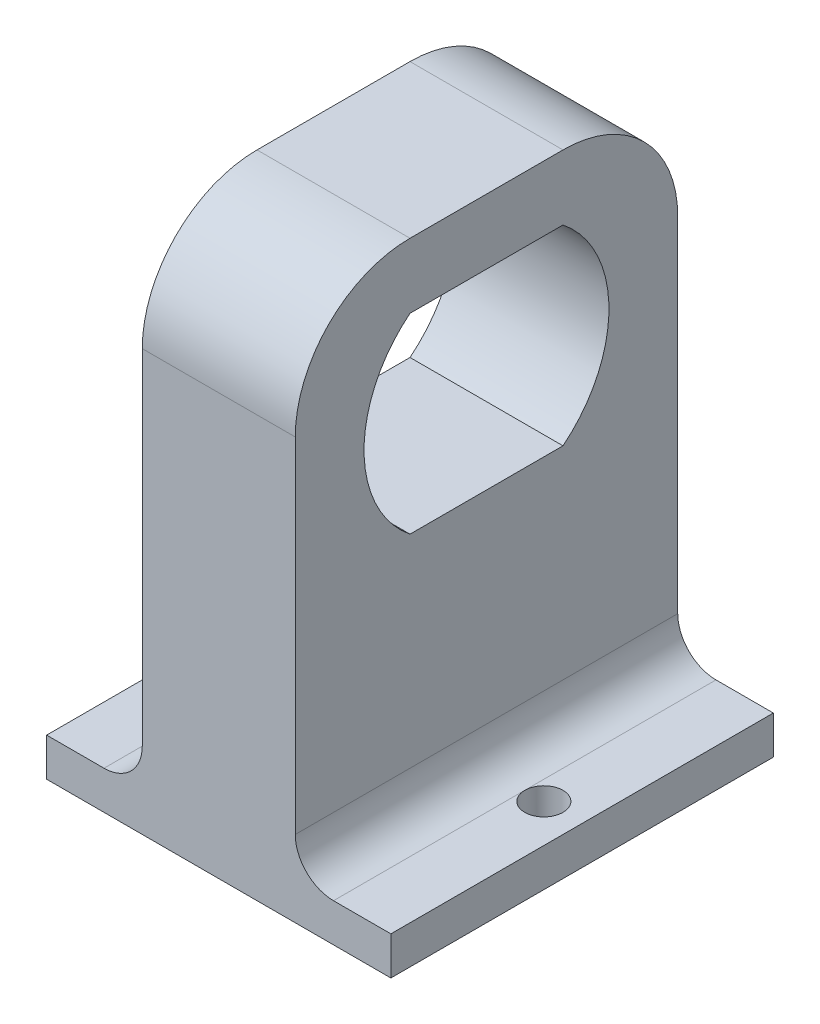
ISO-10303-21;
HEADER;
FILE_DESCRIPTION(('STEP AP214'),'2;1');
FILE_NAME('part.step','',(''),(''),'','','');
FILE_SCHEMA(('AUTOMOTIVE_DESIGN { 1 0 10303 214 1 1 1 1 }'));
ENDSEC;
DATA;
#1=APPLICATION_CONTEXT('core data for automotive mechanical design processes');
#2=APPLICATION_PROTOCOL_DEFINITION('international standard','automotive_design',2000,#1);
#3=PRODUCT_CONTEXT('',#1,'mechanical');
#4=PRODUCT('Part','Part','',(#3));
#5=PRODUCT_RELATED_PRODUCT_CATEGORY('part','',(#4));
#6=PRODUCT_DEFINITION_FORMATION('','',#4);
#7=PRODUCT_DEFINITION_CONTEXT('part definition',#1,'design');
#8=PRODUCT_DEFINITION('design','',#6,#7);
#9=PRODUCT_DEFINITION_SHAPE('','',#8);
#10=(LENGTH_UNIT() NAMED_UNIT(*) SI_UNIT(.MILLI.,.METRE.));
#11=(NAMED_UNIT(*) PLANE_ANGLE_UNIT() SI_UNIT($,.RADIAN.));
#12=(NAMED_UNIT(*) SI_UNIT($,.STERADIAN.) SOLID_ANGLE_UNIT());
#13=UNCERTAINTY_MEASURE_WITH_UNIT(LENGTH_MEASURE(1.E-05),#10,'distance_accuracy_value','');
#14=(GEOMETRIC_REPRESENTATION_CONTEXT(3) GLOBAL_UNCERTAINTY_ASSIGNED_CONTEXT((#13)) GLOBAL_UNIT_ASSIGNED_CONTEXT((#10,
#11,#12)) REPRESENTATION_CONTEXT('',''));
#15=CARTESIAN_POINT('',(0.,0.,0.));
#16=DIRECTION('',(0.,0.,1.));
#17=DIRECTION('',(1.,0.,0.));
#18=AXIS2_PLACEMENT_3D('',#15,#16,#17);
#19=CARTESIAN_POINT('',(12.7,0.,0.));
#20=DIRECTION('',(-1.,0.,0.));
#21=DIRECTION('',(0.,0.,1.));
#22=AXIS2_PLACEMENT_3D('',#19,#20,#21);
#23=PLANE('',#22);
#24=CARTESIAN_POINT('',(12.7,17.78,0.));
#25=DIRECTION('',(1.,0.,0.));
#26=DIRECTION('',(0.,0.,-1.));
#27=AXIS2_PLACEMENT_3D('',#24,#25,#26);
#28=CIRCLE('',#27,20.3299194538493);
#29=CARTESIAN_POINT('',(12.7,1.90500000000003,-12.7));
#30=VERTEX_POINT('',#29);
#31=CARTESIAN_POINT('',(12.7,33.655,-12.7));
#32=VERTEX_POINT('',#31);
#33=EDGE_CURVE('E205',#30,#32,#28,.T.);
#34=ORIENTED_EDGE('',*,*,#33,.F.);
#35=DIRECTION('',(0.,0.,-1.));
#36=VECTOR('',#35,1.);
#37=CARTESIAN_POINT('',(12.7,1.90500000000003,12.7));
#38=LINE('',#37,#36);
#39=CARTESIAN_POINT('',(12.7,1.90500000000003,12.7));
#40=VERTEX_POINT('',#39);
#41=EDGE_CURVE('E213',#40,#30,#38,.T.);
#42=ORIENTED_EDGE('',*,*,#41,.F.);
#43=CARTESIAN_POINT('',(12.7,17.78,0.));
#44=DIRECTION('',(1.,0.,0.));
#45=DIRECTION('',(0.,0.,-1.));
#46=AXIS2_PLACEMENT_3D('',#43,#44,#45);
#47=CIRCLE('',#46,20.3299194538493);
#48=CARTESIAN_POINT('',(12.7,33.655,12.7));
#49=VERTEX_POINT('',#48);
#50=EDGE_CURVE('E210',#49,#40,#47,.T.);
#51=ORIENTED_EDGE('',*,*,#50,.F.);
#52=DIRECTION('',(0.,0.,1.));
#53=VECTOR('',#52,1.);
#54=CARTESIAN_POINT('',(12.7,33.655,12.7));
#55=LINE('',#54,#53);
#56=EDGE_CURVE('E207',#32,#49,#55,.T.);
#57=ORIENTED_EDGE('',*,*,#56,.F.);
#58=EDGE_LOOP('',(#34,#42,#51,#57));
#59=FACE_BOUND('',#58,.T.);
#60=DIRECTION('',(0.,1.,0.));
#61=VECTOR('',#60,1.);
#62=CARTESIAN_POINT('',(12.7,-44.45,-31.75));
#63=LINE('',#62,#61);
#64=CARTESIAN_POINT('',(12.7,-31.75,-31.75));
#65=VERTEX_POINT('',#64);
#66=CARTESIAN_POINT('',(12.7,25.4,-31.75));
#67=VERTEX_POINT('',#66);
#68=EDGE_CURVE('E236',#65,#67,#63,.T.);
#69=ORIENTED_EDGE('',*,*,#68,.T.);
#70=CARTESIAN_POINT('',(12.7,25.4,-12.7));
#71=DIRECTION('',(-1.,0.,0.));
#72=DIRECTION('',(0.,0.,1.));
#73=AXIS2_PLACEMENT_3D('',#70,#71,#72);
#74=CIRCLE('',#73,19.05);
#75=CARTESIAN_POINT('',(12.7,44.45,-12.7));
#76=VERTEX_POINT('',#75);
#77=EDGE_CURVE('E41',#67,#76,#74,.F.);
#78=ORIENTED_EDGE('',*,*,#77,.T.);
#79=DIRECTION('',(0.,0.,1.));
#80=VECTOR('',#79,1.);
#81=CARTESIAN_POINT('',(12.7,44.45,31.75));
#82=LINE('',#81,#80);
#83=CARTESIAN_POINT('',(12.7,44.45,12.7));
#84=VERTEX_POINT('',#83);
#85=EDGE_CURVE('E238',#76,#84,#82,.T.);
#86=ORIENTED_EDGE('',*,*,#85,.T.);
#87=CARTESIAN_POINT('',(12.7,25.4,12.7));
#88=DIRECTION('',(-1.,0.,0.));
#89=DIRECTION('',(0.,0.,1.));
#90=AXIS2_PLACEMENT_3D('',#87,#88,#89);
#91=CIRCLE('',#90,19.05);
#92=CARTESIAN_POINT('',(12.7,25.4,31.75));
#93=VERTEX_POINT('',#92);
#94=EDGE_CURVE('E48',#84,#93,#91,.F.);
#95=ORIENTED_EDGE('',*,*,#94,.T.);
#96=DIRECTION('',(0.,-1.,0.));
#97=VECTOR('',#96,1.);
#98=CARTESIAN_POINT('',(12.7,-44.45,31.75));
#99=LINE('',#98,#97);
#100=CARTESIAN_POINT('',(12.7,-31.75,31.75));
#101=VERTEX_POINT('',#100);
#102=EDGE_CURVE('E241',#93,#101,#99,.T.);
#103=ORIENTED_EDGE('',*,*,#102,.T.);
#104=DIRECTION('',(0.,0.,1.));
#105=VECTOR('',#104,1.);
#106=CARTESIAN_POINT('',(12.7,-31.75,-31.75));
#107=LINE('',#106,#105);
#108=EDGE_CURVE('E259',#101,#65,#107,.F.);
#109=ORIENTED_EDGE('',*,*,#108,.T.);
#110=EDGE_LOOP('',(#69,#78,#86,#95,#103,#109));
#111=FACE_BOUND('',#110,.T.);
#112=ADVANCED_FACE('F33',(#59,#111),#23,.F.);
#113=CARTESIAN_POINT('',(-12.7,0.,0.));
#114=DIRECTION('',(-1.,0.,0.));
#115=DIRECTION('',(0.,0.,1.));
#116=AXIS2_PLACEMENT_3D('',#113,#114,#115);
#117=PLANE('',#116);
#118=DIRECTION('',(0.,0.,-1.));
#119=VECTOR('',#118,1.);
#120=CARTESIAN_POINT('',(-12.7,1.90500000000003,12.7));
#121=LINE('',#120,#119);
#122=CARTESIAN_POINT('',(-12.7,1.90500000000002,12.7));
#123=VERTEX_POINT('',#122);
#124=CARTESIAN_POINT('',(-12.7,1.90500000000003,-12.7));
#125=VERTEX_POINT('',#124);
#126=EDGE_CURVE('E208',#123,#125,#121,.T.);
#127=ORIENTED_EDGE('',*,*,#126,.T.);
#128=CARTESIAN_POINT('',(-12.7,17.78,0.));
#129=DIRECTION('',(1.,0.,0.));
#130=DIRECTION('',(0.,0.,-1.));
#131=AXIS2_PLACEMENT_3D('',#128,#129,#130);
#132=CIRCLE('',#131,20.3299194538493);
#133=CARTESIAN_POINT('',(-12.7,33.655,-12.7));
#134=VERTEX_POINT('',#133);
#135=EDGE_CURVE('E204',#125,#134,#132,.T.);
#136=ORIENTED_EDGE('',*,*,#135,.T.);
#137=DIRECTION('',(0.,0.,1.));
#138=VECTOR('',#137,1.);
#139=CARTESIAN_POINT('',(-12.7,33.655,12.7));
#140=LINE('',#139,#138);
#141=CARTESIAN_POINT('',(-12.7,33.655,12.7));
#142=VERTEX_POINT('',#141);
#143=EDGE_CURVE('E218',#134,#142,#140,.T.);
#144=ORIENTED_EDGE('',*,*,#143,.T.);
#145=CARTESIAN_POINT('',(-12.7,17.78,0.));
#146=DIRECTION('',(1.,0.,0.));
#147=DIRECTION('',(0.,0.,-1.));
#148=AXIS2_PLACEMENT_3D('',#145,#146,#147);
#149=CIRCLE('',#148,20.3299194538493);
#150=EDGE_CURVE('E221',#142,#123,#149,.T.);
#151=ORIENTED_EDGE('',*,*,#150,.T.);
#152=EDGE_LOOP('',(#127,#136,#144,#151));
#153=FACE_BOUND('',#152,.T.);
#154=DIRECTION('',(0.,0.,1.));
#155=VECTOR('',#154,1.);
#156=CARTESIAN_POINT('',(-12.7,44.45,31.75));
#157=LINE('',#156,#155);
#158=CARTESIAN_POINT('',(-12.7,44.45,-12.7));
#159=VERTEX_POINT('',#158);
#160=CARTESIAN_POINT('',(-12.7,44.45,12.7));
#161=VERTEX_POINT('',#160);
#162=EDGE_CURVE('E244',#159,#161,#157,.T.);
#163=ORIENTED_EDGE('',*,*,#162,.F.);
#164=CARTESIAN_POINT('',(-12.7,25.4,-12.7));
#165=DIRECTION('',(-1.,0.,0.));
#166=DIRECTION('',(0.,0.,1.));
#167=AXIS2_PLACEMENT_3D('',#164,#165,#166);
#168=CIRCLE('',#167,19.05);
#169=CARTESIAN_POINT('',(-12.7,25.4,-31.75));
#170=VERTEX_POINT('',#169);
#171=EDGE_CURVE('E277',#159,#170,#168,.T.);
#172=ORIENTED_EDGE('',*,*,#171,.T.);
#173=DIRECTION('',(0.,1.,0.));
#174=VECTOR('',#173,1.);
#175=CARTESIAN_POINT('',(-12.7,-44.45,-31.75));
#176=LINE('',#175,#174);
#177=CARTESIAN_POINT('',(-12.7,-31.75,-31.75));
#178=VERTEX_POINT('',#177);
#179=EDGE_CURVE('E235',#178,#170,#176,.T.);
#180=ORIENTED_EDGE('',*,*,#179,.F.);
#181=DIRECTION('',(0.,0.,1.));
#182=VECTOR('',#181,1.);
#183=CARTESIAN_POINT('',(-12.7,-31.75,0.));
#184=LINE('',#183,#182);
#185=CARTESIAN_POINT('',(-12.7,-31.75,31.75));
#186=VERTEX_POINT('',#185);
#187=EDGE_CURVE('E166',#178,#186,#184,.T.);
#188=ORIENTED_EDGE('',*,*,#187,.T.);
#189=DIRECTION('',(0.,-1.,0.));
#190=VECTOR('',#189,1.);
#191=CARTESIAN_POINT('',(-12.7,-44.45,31.75));
#192=LINE('',#191,#190);
#193=CARTESIAN_POINT('',(-12.7,25.4,31.75));
#194=VERTEX_POINT('',#193);
#195=EDGE_CURVE('E239',#194,#186,#192,.T.);
#196=ORIENTED_EDGE('',*,*,#195,.F.);
#197=CARTESIAN_POINT('',(-12.7,25.4,12.7));
#198=DIRECTION('',(-1.,0.,0.));
#199=DIRECTION('',(0.,0.,1.));
#200=AXIS2_PLACEMENT_3D('',#197,#198,#199);
#201=CIRCLE('',#200,19.05);
#202=EDGE_CURVE('E275',#194,#161,#201,.T.);
#203=ORIENTED_EDGE('',*,*,#202,.T.);
#204=EDGE_LOOP('',(#163,#172,#180,#188,#196,#203));
#205=FACE_BOUND('',#204,.T.);
#206=ADVANCED_FACE('F291',(#153,#205),#117,.T.);
#207=CARTESIAN_POINT('',(12.7,-44.45,-31.75));
#208=DIRECTION('',(0.,0.,1.));
#209=DIRECTION('',(1.,0.,0.));
#210=AXIS2_PLACEMENT_3D('',#207,#208,#209);
#211=PLANE('',#210);
#212=ORIENTED_EDGE('',*,*,#179,.T.);
#213=DIRECTION('',(-1.,0.,0.));
#214=VECTOR('',#213,1.);
#215=CARTESIAN_POINT('',(12.7,25.4,-31.75));
#216=LINE('',#215,#214);
#217=EDGE_CURVE('E56',#170,#67,#216,.F.);
#218=ORIENTED_EDGE('',*,*,#217,.T.);
#219=ORIENTED_EDGE('',*,*,#68,.F.);
#220=CARTESIAN_POINT('',(19.05,-31.75,-31.75));
#221=DIRECTION('',(0.,0.,1.));
#222=DIRECTION('',(1.,0.,0.));
#223=AXIS2_PLACEMENT_3D('',#220,#221,#222);
#224=CIRCLE('',#223,6.35);
#225=CARTESIAN_POINT('',(19.05,-38.1,-31.75));
#226=VERTEX_POINT('',#225);
#227=EDGE_CURVE('E268',#65,#226,#224,.T.);
#228=ORIENTED_EDGE('',*,*,#227,.T.);
#229=DIRECTION('',(-1.,0.,0.));
#230=VECTOR('',#229,1.);
#231=CARTESIAN_POINT('',(28.575,-38.1,-31.75));
#232=LINE('',#231,#230);
#233=CARTESIAN_POINT('',(28.575,-38.1,-31.75));
#234=VERTEX_POINT('',#233);
#235=EDGE_CURVE('E201',#234,#226,#232,.T.);
#236=ORIENTED_EDGE('',*,*,#235,.F.);
#237=DIRECTION('',(0.,1.,0.));
#238=VECTOR('',#237,1.);
#239=CARTESIAN_POINT('',(28.575,-44.45,-31.75));
#240=LINE('',#239,#238);
#241=CARTESIAN_POINT('',(28.575,-44.45,-31.75));
#242=VERTEX_POINT('',#241);
#243=EDGE_CURVE('E174',#242,#234,#240,.T.);
#244=ORIENTED_EDGE('',*,*,#243,.F.);
#245=DIRECTION('',(-1.,0.,0.));
#246=VECTOR('',#245,1.);
#247=CARTESIAN_POINT('',(12.7,-44.45,-31.75));
#248=LINE('',#247,#246);
#249=CARTESIAN_POINT('',(-28.575,-44.45,-31.75));
#250=VERTEX_POINT('',#249);
#251=EDGE_CURVE('E167',#242,#250,#248,.T.);
#252=ORIENTED_EDGE('',*,*,#251,.T.);
#253=DIRECTION('',(0.,1.,0.));
#254=VECTOR('',#253,1.);
#255=CARTESIAN_POINT('',(-28.575,-44.45,-31.75));
#256=LINE('',#255,#254);
#257=CARTESIAN_POINT('',(-28.575,-38.1,-31.75));
#258=VERTEX_POINT('',#257);
#259=EDGE_CURVE('E183',#250,#258,#256,.T.);
#260=ORIENTED_EDGE('',*,*,#259,.T.);
#261=CARTESIAN_POINT('',(-19.05,-38.1,-31.75));
#262=VERTEX_POINT('',#261);
#263=EDGE_CURVE('E200',#262,#258,#232,.T.);
#264=ORIENTED_EDGE('',*,*,#263,.F.);
#265=CARTESIAN_POINT('',(-19.05,-31.75,-31.75));
#266=DIRECTION('',(0.,0.,1.));
#267=DIRECTION('',(1.,0.,0.));
#268=AXIS2_PLACEMENT_3D('',#265,#266,#267);
#269=CIRCLE('',#268,6.35);
#270=EDGE_CURVE('E263',#262,#178,#269,.T.);
#271=ORIENTED_EDGE('',*,*,#270,.T.);
#272=EDGE_LOOP('',(#212,#218,#219,#228,#236,#244,#252,#260,#264,#271));
#273=FACE_BOUND('',#272,.T.);
#274=ADVANCED_FACE('F293',(#273),#211,.F.);
#275=CARTESIAN_POINT('',(12.7,44.45,31.75));
#276=DIRECTION('',(0.,-1.,0.));
#277=DIRECTION('',(0.,0.,-1.));
#278=AXIS2_PLACEMENT_3D('',#275,#276,#277);
#279=PLANE('',#278);
#280=ORIENTED_EDGE('',*,*,#85,.F.);
#281=DIRECTION('',(-1.,0.,0.));
#282=VECTOR('',#281,1.);
#283=CARTESIAN_POINT('',(12.7,44.45,-12.7));
#284=LINE('',#283,#282);
#285=EDGE_CURVE('E272',#76,#159,#284,.T.);
#286=ORIENTED_EDGE('',*,*,#285,.T.);
#287=ORIENTED_EDGE('',*,*,#162,.T.);
#288=DIRECTION('',(-1.,0.,0.));
#289=VECTOR('',#288,1.);
#290=CARTESIAN_POINT('',(12.7,44.45,12.7));
#291=LINE('',#290,#289);
#292=EDGE_CURVE('E270',#161,#84,#291,.F.);
#293=ORIENTED_EDGE('',*,*,#292,.T.);
#294=EDGE_LOOP('',(#280,#286,#287,#293));
#295=FACE_BOUND('',#294,.T.);
#296=ADVANCED_FACE('F285',(#295),#279,.F.);
#297=CARTESIAN_POINT('',(12.7,-44.45,31.75));
#298=DIRECTION('',(0.,0.,-1.));
#299=DIRECTION('',(-1.,0.,0.));
#300=AXIS2_PLACEMENT_3D('',#297,#298,#299);
#301=PLANE('',#300);
#302=ORIENTED_EDGE('',*,*,#102,.F.);
#303=DIRECTION('',(-1.,0.,0.));
#304=VECTOR('',#303,1.);
#305=CARTESIAN_POINT('',(12.7,25.4,31.75));
#306=LINE('',#305,#304);
#307=EDGE_CURVE('E11',#93,#194,#306,.T.);
#308=ORIENTED_EDGE('',*,*,#307,.T.);
#309=ORIENTED_EDGE('',*,*,#195,.T.);
#310=CARTESIAN_POINT('',(-19.05,-31.75,31.75));
#311=DIRECTION('',(0.,0.,-1.));
#312=DIRECTION('',(-1.,0.,0.));
#313=AXIS2_PLACEMENT_3D('',#310,#311,#312);
#314=CIRCLE('',#313,6.35);
#315=CARTESIAN_POINT('',(-19.05,-38.1,31.75));
#316=VERTEX_POINT('',#315);
#317=EDGE_CURVE('E261',#186,#316,#314,.T.);
#318=ORIENTED_EDGE('',*,*,#317,.T.);
#319=DIRECTION('',(-1.,0.,0.));
#320=VECTOR('',#319,1.);
#321=CARTESIAN_POINT('',(28.575,-38.1,31.75));
#322=LINE('',#321,#320);
#323=CARTESIAN_POINT('',(-28.575,-38.1,31.75));
#324=VERTEX_POINT('',#323);
#325=EDGE_CURVE('E191',#316,#324,#322,.T.);
#326=ORIENTED_EDGE('',*,*,#325,.T.);
#327=DIRECTION('',(0.,-1.,0.));
#328=VECTOR('',#327,1.);
#329=CARTESIAN_POINT('',(-28.575,-44.45,31.75));
#330=LINE('',#329,#328);
#331=CARTESIAN_POINT('',(-28.575,-44.45,31.75));
#332=VERTEX_POINT('',#331);
#333=EDGE_CURVE('E162',#324,#332,#330,.T.);
#334=ORIENTED_EDGE('',*,*,#333,.T.);
#335=DIRECTION('',(-1.,0.,0.));
#336=VECTOR('',#335,1.);
#337=CARTESIAN_POINT('',(12.7,-44.45,31.75));
#338=LINE('',#337,#336);
#339=CARTESIAN_POINT('',(28.575,-44.45,31.75));
#340=VERTEX_POINT('',#339);
#341=EDGE_CURVE('E155',#340,#332,#338,.T.);
#342=ORIENTED_EDGE('',*,*,#341,.F.);
#343=DIRECTION('',(0.,-1.,0.));
#344=VECTOR('',#343,1.);
#345=CARTESIAN_POINT('',(28.575,-44.45,31.75));
#346=LINE('',#345,#344);
#347=CARTESIAN_POINT('',(28.575,-38.1,31.75));
#348=VERTEX_POINT('',#347);
#349=EDGE_CURVE('E160',#348,#340,#346,.T.);
#350=ORIENTED_EDGE('',*,*,#349,.F.);
#351=CARTESIAN_POINT('',(19.05,-38.1,31.75));
#352=VERTEX_POINT('',#351);
#353=EDGE_CURVE('E198',#348,#352,#322,.T.);
#354=ORIENTED_EDGE('',*,*,#353,.T.);
#355=CARTESIAN_POINT('',(19.05,-31.75,31.75));
#356=DIRECTION('',(0.,0.,-1.));
#357=DIRECTION('',(-1.,0.,0.));
#358=AXIS2_PLACEMENT_3D('',#355,#356,#357);
#359=CIRCLE('',#358,6.35);
#360=EDGE_CURVE('E265',#352,#101,#359,.T.);
#361=ORIENTED_EDGE('',*,*,#360,.T.);
#362=EDGE_LOOP('',(#302,#308,#309,#318,#326,#334,#342,#350,#354,#361));
#363=FACE_BOUND('',#362,.T.);
#364=ADVANCED_FACE('F157',(#363),#301,.F.);
#365=CARTESIAN_POINT('',(12.7,-44.45,31.75));
#366=DIRECTION('',(0.,1.,0.));
#367=DIRECTION('',(0.,0.,1.));
#368=AXIS2_PLACEMENT_3D('',#365,#366,#367);
#369=PLANE('',#368);
#370=CARTESIAN_POINT('',(-22.225,-44.45,0.));
#371=DIRECTION('',(0.,-1.,0.));
#372=DIRECTION('',(0.,0.,1.));
#373=AXIS2_PLACEMENT_3D('',#370,#371,#372);
#374=CIRCLE('',#373,3.175);
#375=CARTESIAN_POINT('',(-22.225,-44.45,3.175));
#376=VERTEX_POINT('',#375);
#377=EDGE_CURVE('E353',#376,#376,#374,.T.);
#378=ORIENTED_EDGE('',*,*,#377,.F.);
#379=EDGE_LOOP('',(#378));
#380=FACE_BOUND('',#379,.T.);
#381=CARTESIAN_POINT('',(22.225,-44.45,0.));
#382=DIRECTION('',(0.,1.,0.));
#383=DIRECTION('',(0.,0.,1.));
#384=AXIS2_PLACEMENT_3D('',#381,#382,#383);
#385=CIRCLE('',#384,3.175);
#386=CARTESIAN_POINT('',(22.225,-44.45,3.175));
#387=VERTEX_POINT('',#386);
#388=EDGE_CURVE('E194',#387,#387,#385,.T.);
#389=ORIENTED_EDGE('',*,*,#388,.T.);
#390=EDGE_LOOP('',(#389));
#391=FACE_BOUND('',#390,.T.);
#392=ORIENTED_EDGE('',*,*,#341,.T.);
#393=DIRECTION('',(0.,0.,-1.));
#394=VECTOR('',#393,1.);
#395=CARTESIAN_POINT('',(-28.575,-44.45,31.75));
#396=LINE('',#395,#394);
#397=EDGE_CURVE('E193',#332,#250,#396,.T.);
#398=ORIENTED_EDGE('',*,*,#397,.T.);
#399=ORIENTED_EDGE('',*,*,#251,.F.);
#400=DIRECTION('',(0.,0.,-1.));
#401=VECTOR('',#400,1.);
#402=CARTESIAN_POINT('',(28.575,-44.45,31.75));
#403=LINE('',#402,#401);
#404=EDGE_CURVE('E170',#340,#242,#403,.T.);
#405=ORIENTED_EDGE('',*,*,#404,.F.);
#406=EDGE_LOOP('',(#392,#398,#399,#405));
#407=FACE_BOUND('',#406,.T.);
#408=ADVANCED_FACE('F171',(#380,#391,#407),#369,.F.);
#409=CARTESIAN_POINT('',(12.7,17.78,0.));
#410=DIRECTION('',(-1.,0.,0.));
#411=DIRECTION('',(0.,0.,1.));
#412=AXIS2_PLACEMENT_3D('',#409,#410,#411);
#413=CYLINDRICAL_SURFACE('',#412,20.3299194538493);
#414=ORIENTED_EDGE('',*,*,#135,.F.);
#415=DIRECTION('',(-1.,0.,0.));
#416=VECTOR('',#415,1.);
#417=CARTESIAN_POINT('',(12.7,1.90500000000003,-12.7));
#418=LINE('',#417,#416);
#419=EDGE_CURVE('E215',#30,#125,#418,.T.);
#420=ORIENTED_EDGE('',*,*,#419,.F.);
#421=ORIENTED_EDGE('',*,*,#33,.T.);
#422=DIRECTION('',(-1.,0.,0.));
#423=VECTOR('',#422,1.);
#424=CARTESIAN_POINT('',(12.7,33.655,-12.7));
#425=LINE('',#424,#423);
#426=EDGE_CURVE('E232',#32,#134,#425,.T.);
#427=ORIENTED_EDGE('',*,*,#426,.T.);
#428=EDGE_LOOP('',(#414,#420,#421,#427));
#429=FACE_BOUND('',#428,.T.);
#430=ADVANCED_FACE('F320',(#429),#413,.F.);
#431=CARTESIAN_POINT('',(12.7,33.655,12.7));
#432=DIRECTION('',(0.,-1.,0.));
#433=DIRECTION('',(0.,0.,-1.));
#434=AXIS2_PLACEMENT_3D('',#431,#432,#433);
#435=PLANE('',#434);
#436=ORIENTED_EDGE('',*,*,#143,.F.);
#437=ORIENTED_EDGE('',*,*,#426,.F.);
#438=ORIENTED_EDGE('',*,*,#56,.T.);
#439=DIRECTION('',(-1.,0.,0.));
#440=VECTOR('',#439,1.);
#441=CARTESIAN_POINT('',(12.7,33.655,12.7));
#442=LINE('',#441,#440);
#443=EDGE_CURVE('E230',#49,#142,#442,.T.);
#444=ORIENTED_EDGE('',*,*,#443,.T.);
#445=EDGE_LOOP('',(#436,#437,#438,#444));
#446=FACE_BOUND('',#445,.T.);
#447=ADVANCED_FACE('F384',(#446),#435,.T.);
#448=CARTESIAN_POINT('',(12.7,17.78,0.));
#449=DIRECTION('',(-1.,0.,0.));
#450=DIRECTION('',(0.,0.,1.));
#451=AXIS2_PLACEMENT_3D('',#448,#449,#450);
#452=CYLINDRICAL_SURFACE('',#451,20.3299194538493);
#453=ORIENTED_EDGE('',*,*,#150,.F.);
#454=ORIENTED_EDGE('',*,*,#443,.F.);
#455=ORIENTED_EDGE('',*,*,#50,.T.);
#456=DIRECTION('',(-1.,0.,0.));
#457=VECTOR('',#456,1.);
#458=CARTESIAN_POINT('',(12.7,1.90500000000002,12.7));
#459=LINE('',#458,#457);
#460=EDGE_CURVE('E228',#40,#123,#459,.T.);
#461=ORIENTED_EDGE('',*,*,#460,.T.);
#462=EDGE_LOOP('',(#453,#454,#455,#461));
#463=FACE_BOUND('',#462,.T.);
#464=ADVANCED_FACE('F381',(#463),#452,.F.);
#465=CARTESIAN_POINT('',(12.7,1.90500000000003,12.7));
#466=DIRECTION('',(0.,1.,0.));
#467=DIRECTION('',(0.,0.,1.));
#468=AXIS2_PLACEMENT_3D('',#465,#466,#467);
#469=PLANE('',#468);
#470=ORIENTED_EDGE('',*,*,#126,.F.);
#471=ORIENTED_EDGE('',*,*,#460,.F.);
#472=ORIENTED_EDGE('',*,*,#41,.T.);
#473=ORIENTED_EDGE('',*,*,#419,.T.);
#474=EDGE_LOOP('',(#470,#471,#472,#473));
#475=FACE_BOUND('',#474,.T.);
#476=ADVANCED_FACE('F375',(#475),#469,.T.);
#477=CARTESIAN_POINT('',(-28.575,0.,0.));
#478=DIRECTION('',(-1.,0.,0.));
#479=DIRECTION('',(0.,0.,1.));
#480=AXIS2_PLACEMENT_3D('',#477,#478,#479);
#481=PLANE('',#480);
#482=ORIENTED_EDGE('',*,*,#333,.F.);
#483=DIRECTION('',(0.,0.,1.));
#484=VECTOR('',#483,1.);
#485=CARTESIAN_POINT('',(-28.575,-38.1,31.75));
#486=LINE('',#485,#484);
#487=EDGE_CURVE('E180',#258,#324,#486,.T.);
#488=ORIENTED_EDGE('',*,*,#487,.F.);
#489=ORIENTED_EDGE('',*,*,#259,.F.);
#490=ORIENTED_EDGE('',*,*,#397,.F.);
#491=EDGE_LOOP('',(#482,#488,#489,#490));
#492=FACE_BOUND('',#491,.T.);
#493=ADVANCED_FACE('F372',(#492),#481,.T.);
#494=CARTESIAN_POINT('',(28.575,-38.1,31.75));
#495=DIRECTION('',(0.,-1.,0.));
#496=DIRECTION('',(0.,0.,-1.));
#497=AXIS2_PLACEMENT_3D('',#494,#495,#496);
#498=PLANE('',#497);
#499=DIRECTION('',(0.,0.,1.));
#500=VECTOR('',#499,1.);
#501=CARTESIAN_POINT('',(-19.05,-38.1,31.75));
#502=LINE('',#501,#500);
#503=CARTESIAN_POINT('',(-19.05,-38.1,0.));
#504=VERTEX_POINT('',#503);
#505=EDGE_CURVE('E252',#316,#504,#502,.F.);
#506=ORIENTED_EDGE('',*,*,#505,.T.);
#507=CARTESIAN_POINT('',(-22.225,-38.1,0.));
#508=DIRECTION('',(0.,-1.,0.));
#509=DIRECTION('',(0.,0.,1.));
#510=AXIS2_PLACEMENT_3D('',#507,#508,#509);
#511=CIRCLE('',#510,3.175);
#512=EDGE_CURVE('E356',#504,#504,#511,.T.);
#513=ORIENTED_EDGE('',*,*,#512,.T.);
#514=EDGE_CURVE('E251',#504,#262,#502,.F.);
#515=ORIENTED_EDGE('',*,*,#514,.T.);
#516=ORIENTED_EDGE('',*,*,#263,.T.);
#517=ORIENTED_EDGE('',*,*,#487,.T.);
#518=ORIENTED_EDGE('',*,*,#325,.F.);
#519=EDGE_LOOP('',(#506,#513,#515,#516,#517,#518));
#520=FACE_BOUND('',#519,.T.);
#521=ADVANCED_FACE('F363',(#520),#498,.F.);
#522=DIRECTION('',(0.,0.,1.));
#523=VECTOR('',#522,1.);
#524=CARTESIAN_POINT('',(19.05,-38.1,31.75));
#525=LINE('',#524,#523);
#526=CARTESIAN_POINT('',(19.05,-38.1,0.));
#527=VERTEX_POINT('',#526);
#528=EDGE_CURVE('E256',#226,#527,#525,.T.);
#529=ORIENTED_EDGE('',*,*,#528,.T.);
#530=CARTESIAN_POINT('',(22.225,-38.1,0.));
#531=DIRECTION('',(0.,1.,0.));
#532=DIRECTION('',(0.,0.,1.));
#533=AXIS2_PLACEMENT_3D('',#530,#531,#532);
#534=CIRCLE('',#533,3.175);
#535=EDGE_CURVE('E186',#527,#527,#534,.T.);
#536=ORIENTED_EDGE('',*,*,#535,.F.);
#537=EDGE_CURVE('E255',#527,#352,#525,.T.);
#538=ORIENTED_EDGE('',*,*,#537,.T.);
#539=ORIENTED_EDGE('',*,*,#353,.F.);
#540=DIRECTION('',(0.,0.,1.));
#541=VECTOR('',#540,1.);
#542=CARTESIAN_POINT('',(28.575,-38.1,31.75));
#543=LINE('',#542,#541);
#544=EDGE_CURVE('E178',#234,#348,#543,.T.);
#545=ORIENTED_EDGE('',*,*,#544,.F.);
#546=ORIENTED_EDGE('',*,*,#235,.T.);
#547=EDGE_LOOP('',(#529,#536,#538,#539,#545,#546));
#548=FACE_BOUND('',#547,.T.);
#549=ADVANCED_FACE('F350',(#548),#498,.F.);
#550=CARTESIAN_POINT('',(28.575,0.,0.));
#551=DIRECTION('',(-1.,0.,0.));
#552=DIRECTION('',(0.,0.,1.));
#553=AXIS2_PLACEMENT_3D('',#550,#551,#552);
#554=PLANE('',#553);
#555=ORIENTED_EDGE('',*,*,#349,.T.);
#556=ORIENTED_EDGE('',*,*,#404,.T.);
#557=ORIENTED_EDGE('',*,*,#243,.T.);
#558=ORIENTED_EDGE('',*,*,#544,.T.);
#559=EDGE_LOOP('',(#555,#556,#557,#558));
#560=FACE_BOUND('',#559,.T.);
#561=ADVANCED_FACE('F176',(#560),#554,.F.);
#562=CARTESIAN_POINT('',(-19.05,-31.75,0.));
#563=DIRECTION('',(0.,0.,1.));
#564=DIRECTION('',(1.,0.,0.));
#565=AXIS2_PLACEMENT_3D('',#562,#563,#564);
#566=CYLINDRICAL_SURFACE('',#565,6.35);
#567=ORIENTED_EDGE('',*,*,#270,.F.);
#568=ORIENTED_EDGE('',*,*,#514,.F.);
#569=ORIENTED_EDGE('',*,*,#505,.F.);
#570=ORIENTED_EDGE('',*,*,#317,.F.);
#571=ORIENTED_EDGE('',*,*,#187,.F.);
#572=EDGE_LOOP('',(#567,#568,#569,#570,#571));
#573=FACE_BOUND('',#572,.T.);
#574=ADVANCED_FACE('F298',(#573),#566,.F.);
#575=CARTESIAN_POINT('',(19.05,-31.75,31.75));
#576=DIRECTION('',(0.,0.,-1.));
#577=DIRECTION('',(-1.,0.,0.));
#578=AXIS2_PLACEMENT_3D('',#575,#576,#577);
#579=CYLINDRICAL_SURFACE('',#578,6.35);
#580=ORIENTED_EDGE('',*,*,#227,.F.);
#581=ORIENTED_EDGE('',*,*,#108,.F.);
#582=ORIENTED_EDGE('',*,*,#360,.F.);
#583=ORIENTED_EDGE('',*,*,#537,.F.);
#584=ORIENTED_EDGE('',*,*,#528,.F.);
#585=EDGE_LOOP('',(#580,#581,#582,#583,#584));
#586=FACE_BOUND('',#585,.T.);
#587=ADVANCED_FACE('F334',(#586),#579,.F.);
#588=CARTESIAN_POINT('',(22.225,-44.45,0.));
#589=DIRECTION('',(0.,1.,0.));
#590=DIRECTION('',(0.,0.,1.));
#591=AXIS2_PLACEMENT_3D('',#588,#589,#590);
#592=CYLINDRICAL_SURFACE('',#591,3.175);
#593=ORIENTED_EDGE('',*,*,#388,.F.);
#594=EDGE_LOOP('',(#593));
#595=FACE_BOUND('',#594,.T.);
#596=ORIENTED_EDGE('',*,*,#535,.T.);
#597=EDGE_LOOP('',(#596));
#598=FACE_BOUND('',#597,.T.);
#599=ADVANCED_FACE('F336',(#595,#598),#592,.F.);
#600=CARTESIAN_POINT('',(-22.225,-44.45,0.));
#601=DIRECTION('',(0.,1.,0.));
#602=DIRECTION('',(0.,0.,1.));
#603=AXIS2_PLACEMENT_3D('',#600,#601,#602);
#604=CYLINDRICAL_SURFACE('',#603,3.175);
#605=ORIENTED_EDGE('',*,*,#377,.T.);
#606=EDGE_LOOP('',(#605));
#607=FACE_BOUND('',#606,.T.);
#608=ORIENTED_EDGE('',*,*,#512,.F.);
#609=EDGE_LOOP('',(#608));
#610=FACE_BOUND('',#609,.T.);
#611=ADVANCED_FACE('F309',(#607,#610),#604,.F.);
#612=CARTESIAN_POINT('',(12.7,25.4,-12.7));
#613=DIRECTION('',(-1.,0.,0.));
#614=DIRECTION('',(0.,0.,1.));
#615=AXIS2_PLACEMENT_3D('',#612,#613,#614);
#616=CYLINDRICAL_SURFACE('',#615,19.05);
#617=ORIENTED_EDGE('',*,*,#77,.F.);
#618=ORIENTED_EDGE('',*,*,#217,.F.);
#619=ORIENTED_EDGE('',*,*,#171,.F.);
#620=ORIENTED_EDGE('',*,*,#285,.F.);
#621=EDGE_LOOP('',(#617,#618,#619,#620));
#622=FACE_BOUND('',#621,.T.);
#623=ADVANCED_FACE('F288',(#622),#616,.T.);
#624=CARTESIAN_POINT('',(12.7,25.4,12.7));
#625=DIRECTION('',(-1.,0.,0.));
#626=DIRECTION('',(0.,0.,1.));
#627=AXIS2_PLACEMENT_3D('',#624,#625,#626);
#628=CYLINDRICAL_SURFACE('',#627,19.05);
#629=ORIENTED_EDGE('',*,*,#94,.F.);
#630=ORIENTED_EDGE('',*,*,#292,.F.);
#631=ORIENTED_EDGE('',*,*,#202,.F.);
#632=ORIENTED_EDGE('',*,*,#307,.F.);
#633=EDGE_LOOP('',(#629,#630,#631,#632));
#634=FACE_BOUND('',#633,.T.);
#635=ADVANCED_FACE('F35',(#634),#628,.T.);
#636=CLOSED_SHELL('',(#112,#206,#274,#296,#364,#408,#430,#447,#464,#476,#493,#521,#549,#561,
#574,#587,#599,#611,#623,#635));
#637=MANIFOLD_SOLID_BREP('B2',#636);
#638=ADVANCED_BREP_SHAPE_REPRESENTATION('',(#18,#637),#14);
#639=SHAPE_DEFINITION_REPRESENTATION(#9,#638);
ENDSEC;
END-ISO-10303-21;
